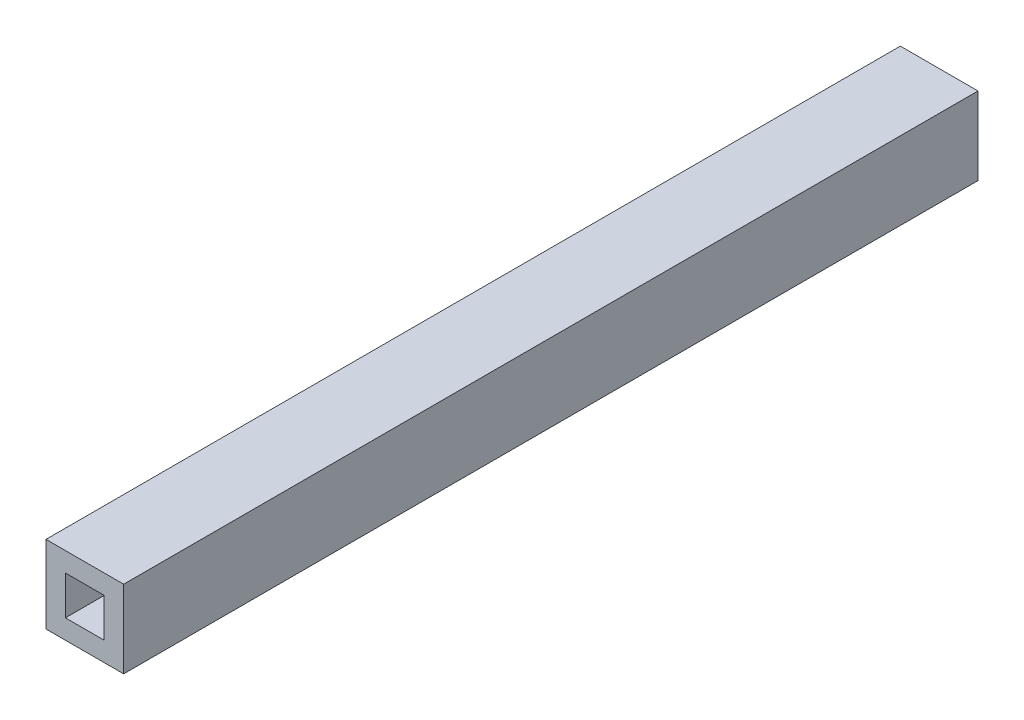
ISO-10303-21;
HEADER;
FILE_DESCRIPTION(('STEP AP214'),'2;1');
FILE_NAME('part.step','',(''),(''),'','','');
FILE_SCHEMA(('AUTOMOTIVE_DESIGN { 1 0 10303 214 1 1 1 1 }'));
ENDSEC;
DATA;
#1=APPLICATION_CONTEXT('core data for automotive mechanical design processes');
#2=APPLICATION_PROTOCOL_DEFINITION('international standard','automotive_design',2000,#1);
#3=PRODUCT_CONTEXT('',#1,'mechanical');
#4=PRODUCT('Part','Part','',(#3));
#5=PRODUCT_RELATED_PRODUCT_CATEGORY('part','',(#4));
#6=PRODUCT_DEFINITION_FORMATION('','',#4);
#7=PRODUCT_DEFINITION_CONTEXT('part definition',#1,'design');
#8=PRODUCT_DEFINITION('design','',#6,#7);
#9=PRODUCT_DEFINITION_SHAPE('','',#8);
#10=(LENGTH_UNIT() NAMED_UNIT(*) SI_UNIT(.MILLI.,.METRE.));
#11=(NAMED_UNIT(*) PLANE_ANGLE_UNIT() SI_UNIT($,.RADIAN.));
#12=(NAMED_UNIT(*) SI_UNIT($,.STERADIAN.) SOLID_ANGLE_UNIT());
#13=UNCERTAINTY_MEASURE_WITH_UNIT(LENGTH_MEASURE(1.E-05),#10,'distance_accuracy_value','');
#14=(GEOMETRIC_REPRESENTATION_CONTEXT(3) GLOBAL_UNCERTAINTY_ASSIGNED_CONTEXT((#13)) GLOBAL_UNIT_ASSIGNED_CONTEXT((#10,
#11,#12)) REPRESENTATION_CONTEXT('',''));
#15=CARTESIAN_POINT('',(0.,0.,0.));
#16=DIRECTION('',(0.,0.,1.));
#17=DIRECTION('',(1.,0.,0.));
#18=AXIS2_PLACEMENT_3D('',#15,#16,#17);
#19=CARTESIAN_POINT('',(0.,0.,220.));
#20=DIRECTION('',(0.,0.,1.));
#21=DIRECTION('',(1.,0.,0.));
#22=AXIS2_PLACEMENT_3D('',#19,#20,#21);
#23=PLANE('',#22);
#24=DIRECTION('',(0.,1.,0.));
#25=VECTOR('',#24,1.);
#26=CARTESIAN_POINT('',(10.,-10.,220.));
#27=LINE('',#26,#25);
#28=CARTESIAN_POINT('',(10.,-10.,220.));
#29=VERTEX_POINT('',#28);
#30=CARTESIAN_POINT('',(10.,10.,220.));
#31=VERTEX_POINT('',#30);
#32=EDGE_CURVE('E158',#29,#31,#27,.T.);
#33=ORIENTED_EDGE('',*,*,#32,.T.);
#34=DIRECTION('',(-1.,0.,0.));
#35=VECTOR('',#34,1.);
#36=CARTESIAN_POINT('',(-10.,10.,220.));
#37=LINE('',#36,#35);
#38=CARTESIAN_POINT('',(-10.,10.,220.));
#39=VERTEX_POINT('',#38);
#40=EDGE_CURVE('E161',#31,#39,#37,.T.);
#41=ORIENTED_EDGE('',*,*,#40,.T.);
#42=DIRECTION('',(0.,-1.,0.));
#43=VECTOR('',#42,1.);
#44=CARTESIAN_POINT('',(-10.,-10.,220.));
#45=LINE('',#44,#43);
#46=CARTESIAN_POINT('',(-10.,-10.,220.));
#47=VERTEX_POINT('',#46);
#48=EDGE_CURVE('E164',#39,#47,#45,.T.);
#49=ORIENTED_EDGE('',*,*,#48,.T.);
#50=DIRECTION('',(1.,0.,0.));
#51=VECTOR('',#50,1.);
#52=CARTESIAN_POINT('',(-10.,-10.,220.));
#53=LINE('',#52,#51);
#54=EDGE_CURVE('E166',#47,#29,#53,.T.);
#55=ORIENTED_EDGE('',*,*,#54,.T.);
#56=EDGE_LOOP('',(#33,#41,#49,#55));
#57=FACE_BOUND('',#56,.T.);
#58=DIRECTION('',(-1.,0.,0.));
#59=VECTOR('',#58,1.);
#60=CARTESIAN_POINT('',(0.,5.,220.));
#61=LINE('',#60,#59);
#62=CARTESIAN_POINT('',(5.,5.,220.));
#63=VERTEX_POINT('',#62);
#64=CARTESIAN_POINT('',(-5.,5.,220.));
#65=VERTEX_POINT('',#64);
#66=EDGE_CURVE('E130',#63,#65,#61,.T.);
#67=ORIENTED_EDGE('',*,*,#66,.F.);
#68=DIRECTION('',(0.,1.,0.));
#69=VECTOR('',#68,1.);
#70=CARTESIAN_POINT('',(5.,0.,220.));
#71=LINE('',#70,#69);
#72=CARTESIAN_POINT('',(5.,-5.,220.));
#73=VERTEX_POINT('',#72);
#74=EDGE_CURVE('E122',#73,#63,#71,.T.);
#75=ORIENTED_EDGE('',*,*,#74,.F.);
#76=DIRECTION('',(1.,0.,0.));
#77=VECTOR('',#76,1.);
#78=CARTESIAN_POINT('',(0.,-5.,220.));
#79=LINE('',#78,#77);
#80=CARTESIAN_POINT('',(-5.,-5.,220.));
#81=VERTEX_POINT('',#80);
#82=EDGE_CURVE('E144',#81,#73,#79,.T.);
#83=ORIENTED_EDGE('',*,*,#82,.F.);
#84=DIRECTION('',(0.,-1.,0.));
#85=VECTOR('',#84,1.);
#86=CARTESIAN_POINT('',(-5.,0.,220.));
#87=LINE('',#86,#85);
#88=EDGE_CURVE('E142',#65,#81,#87,.T.);
#89=ORIENTED_EDGE('',*,*,#88,.F.);
#90=EDGE_LOOP('',(#67,#75,#83,#89));
#91=FACE_BOUND('',#90,.T.);
#92=ADVANCED_FACE('F57',(#57,#91),#23,.T.);
#93=CARTESIAN_POINT('',(0.,0.,0.));
#94=DIRECTION('',(0.,0.,1.));
#95=DIRECTION('',(1.,0.,0.));
#96=AXIS2_PLACEMENT_3D('',#93,#94,#95);
#97=PLANE('',#96);
#98=DIRECTION('',(0.,1.,0.));
#99=VECTOR('',#98,1.);
#100=CARTESIAN_POINT('',(10.,-10.,0.));
#101=LINE('',#100,#99);
#102=CARTESIAN_POINT('',(10.,-10.,0.));
#103=VERTEX_POINT('',#102);
#104=CARTESIAN_POINT('',(10.,10.,0.));
#105=VERTEX_POINT('',#104);
#106=EDGE_CURVE('E138',#103,#105,#101,.T.);
#107=ORIENTED_EDGE('',*,*,#106,.F.);
#108=DIRECTION('',(1.,0.,0.));
#109=VECTOR('',#108,1.);
#110=CARTESIAN_POINT('',(-10.,-10.,0.));
#111=LINE('',#110,#109);
#112=CARTESIAN_POINT('',(-10.,-10.,0.));
#113=VERTEX_POINT('',#112);
#114=EDGE_CURVE('E162',#113,#103,#111,.T.);
#115=ORIENTED_EDGE('',*,*,#114,.F.);
#116=DIRECTION('',(0.,-1.,0.));
#117=VECTOR('',#116,1.);
#118=CARTESIAN_POINT('',(-10.,-10.,0.));
#119=LINE('',#118,#117);
#120=CARTESIAN_POINT('',(-10.,10.,0.));
#121=VERTEX_POINT('',#120);
#122=EDGE_CURVE('E173',#121,#113,#119,.T.);
#123=ORIENTED_EDGE('',*,*,#122,.F.);
#124=DIRECTION('',(-1.,0.,0.));
#125=VECTOR('',#124,1.);
#126=CARTESIAN_POINT('',(-10.,10.,0.));
#127=LINE('',#126,#125);
#128=EDGE_CURVE('E171',#105,#121,#127,.T.);
#129=ORIENTED_EDGE('',*,*,#128,.F.);
#130=EDGE_LOOP('',(#107,#115,#123,#129));
#131=FACE_BOUND('',#130,.T.);
#132=DIRECTION('',(0.,1.,0.));
#133=VECTOR('',#132,1.);
#134=CARTESIAN_POINT('',(5.,0.,0.));
#135=LINE('',#134,#133);
#136=CARTESIAN_POINT('',(5.,-5.,0.));
#137=VERTEX_POINT('',#136);
#138=CARTESIAN_POINT('',(5.,5.,0.));
#139=VERTEX_POINT('',#138);
#140=EDGE_CURVE('E80',#137,#139,#135,.T.);
#141=ORIENTED_EDGE('',*,*,#140,.T.);
#142=DIRECTION('',(-1.,0.,0.));
#143=VECTOR('',#142,1.);
#144=CARTESIAN_POINT('',(0.,5.,0.));
#145=LINE('',#144,#143);
#146=CARTESIAN_POINT('',(-5.,5.,0.));
#147=VERTEX_POINT('',#146);
#148=EDGE_CURVE('E137',#139,#147,#145,.T.);
#149=ORIENTED_EDGE('',*,*,#148,.T.);
#150=DIRECTION('',(0.,-1.,0.));
#151=VECTOR('',#150,1.);
#152=CARTESIAN_POINT('',(-5.,0.,0.));
#153=LINE('',#152,#151);
#154=CARTESIAN_POINT('',(-5.,-5.,0.));
#155=VERTEX_POINT('',#154);
#156=EDGE_CURVE('E150',#147,#155,#153,.T.);
#157=ORIENTED_EDGE('',*,*,#156,.T.);
#158=DIRECTION('',(1.,0.,0.));
#159=VECTOR('',#158,1.);
#160=CARTESIAN_POINT('',(0.,-5.,0.));
#161=LINE('',#160,#159);
#162=EDGE_CURVE('E131',#155,#137,#161,.T.);
#163=ORIENTED_EDGE('',*,*,#162,.T.);
#164=EDGE_LOOP('',(#141,#149,#157,#163));
#165=FACE_BOUND('',#164,.T.);
#166=ADVANCED_FACE('F191',(#131,#165),#97,.F.);
#167=CARTESIAN_POINT('',(10.,-10.,220.));
#168=DIRECTION('',(-1.,0.,0.));
#169=DIRECTION('',(0.,0.,1.));
#170=AXIS2_PLACEMENT_3D('',#167,#168,#169);
#171=PLANE('',#170);
#172=ORIENTED_EDGE('',*,*,#106,.T.);
#173=DIRECTION('',(0.,0.,-1.));
#174=VECTOR('',#173,1.);
#175=CARTESIAN_POINT('',(10.,10.,220.));
#176=LINE('',#175,#174);
#177=EDGE_CURVE('E12',#31,#105,#176,.T.);
#178=ORIENTED_EDGE('',*,*,#177,.F.);
#179=ORIENTED_EDGE('',*,*,#32,.F.);
#180=DIRECTION('',(0.,0.,-1.));
#181=VECTOR('',#180,1.);
#182=CARTESIAN_POINT('',(10.,-10.,220.));
#183=LINE('',#182,#181);
#184=EDGE_CURVE('E168',#29,#103,#183,.T.);
#185=ORIENTED_EDGE('',*,*,#184,.T.);
#186=EDGE_LOOP('',(#172,#178,#179,#185));
#187=FACE_BOUND('',#186,.T.);
#188=ADVANCED_FACE('F59',(#187),#171,.F.);
#189=CARTESIAN_POINT('',(-10.,10.,220.));
#190=DIRECTION('',(0.,-1.,0.));
#191=DIRECTION('',(0.,0.,-1.));
#192=AXIS2_PLACEMENT_3D('',#189,#190,#191);
#193=PLANE('',#192);
#194=ORIENTED_EDGE('',*,*,#128,.T.);
#195=DIRECTION('',(0.,0.,-1.));
#196=VECTOR('',#195,1.);
#197=CARTESIAN_POINT('',(-10.,10.,220.));
#198=LINE('',#197,#196);
#199=EDGE_CURVE('E65',#39,#121,#198,.T.);
#200=ORIENTED_EDGE('',*,*,#199,.F.);
#201=ORIENTED_EDGE('',*,*,#40,.F.);
#202=ORIENTED_EDGE('',*,*,#177,.T.);
#203=EDGE_LOOP('',(#194,#200,#201,#202));
#204=FACE_BOUND('',#203,.T.);
#205=ADVANCED_FACE('F201',(#204),#193,.F.);
#206=CARTESIAN_POINT('',(-10.,-10.,220.));
#207=DIRECTION('',(1.,0.,0.));
#208=DIRECTION('',(0.,0.,-1.));
#209=AXIS2_PLACEMENT_3D('',#206,#207,#208);
#210=PLANE('',#209);
#211=ORIENTED_EDGE('',*,*,#122,.T.);
#212=DIRECTION('',(0.,0.,-1.));
#213=VECTOR('',#212,1.);
#214=CARTESIAN_POINT('',(-10.,-10.,220.));
#215=LINE('',#214,#213);
#216=EDGE_CURVE('E178',#47,#113,#215,.T.);
#217=ORIENTED_EDGE('',*,*,#216,.F.);
#218=ORIENTED_EDGE('',*,*,#48,.F.);
#219=ORIENTED_EDGE('',*,*,#199,.T.);
#220=EDGE_LOOP('',(#211,#217,#218,#219));
#221=FACE_BOUND('',#220,.T.);
#222=ADVANCED_FACE('F185',(#221),#210,.F.);
#223=CARTESIAN_POINT('',(-10.,-10.,220.));
#224=DIRECTION('',(0.,1.,0.));
#225=DIRECTION('',(0.,0.,1.));
#226=AXIS2_PLACEMENT_3D('',#223,#224,#225);
#227=PLANE('',#226);
#228=ORIENTED_EDGE('',*,*,#114,.T.);
#229=ORIENTED_EDGE('',*,*,#184,.F.);
#230=ORIENTED_EDGE('',*,*,#54,.F.);
#231=ORIENTED_EDGE('',*,*,#216,.T.);
#232=EDGE_LOOP('',(#228,#229,#230,#231));
#233=FACE_BOUND('',#232,.T.);
#234=ADVANCED_FACE('F195',(#233),#227,.F.);
#235=CARTESIAN_POINT('',(5.,0.,220.));
#236=DIRECTION('',(-1.,0.,0.));
#237=DIRECTION('',(0.,0.,1.));
#238=AXIS2_PLACEMENT_3D('',#235,#236,#237);
#239=PLANE('',#238);
#240=ORIENTED_EDGE('',*,*,#140,.F.);
#241=DIRECTION('',(0.,0.,-1.));
#242=VECTOR('',#241,1.);
#243=CARTESIAN_POINT('',(5.,-5.,220.));
#244=LINE('',#243,#242);
#245=EDGE_CURVE('E126',#73,#137,#244,.T.);
#246=ORIENTED_EDGE('',*,*,#245,.F.);
#247=ORIENTED_EDGE('',*,*,#74,.T.);
#248=DIRECTION('',(0.,0.,-1.));
#249=VECTOR('',#248,1.);
#250=CARTESIAN_POINT('',(5.,5.,220.));
#251=LINE('',#250,#249);
#252=EDGE_CURVE('E125',#63,#139,#251,.T.);
#253=ORIENTED_EDGE('',*,*,#252,.T.);
#254=EDGE_LOOP('',(#240,#246,#247,#253));
#255=FACE_BOUND('',#254,.T.);
#256=ADVANCED_FACE('F124',(#255),#239,.T.);
#257=CARTESIAN_POINT('',(0.,5.,220.));
#258=DIRECTION('',(0.,-1.,0.));
#259=DIRECTION('',(0.,0.,-1.));
#260=AXIS2_PLACEMENT_3D('',#257,#258,#259);
#261=PLANE('',#260);
#262=ORIENTED_EDGE('',*,*,#148,.F.);
#263=ORIENTED_EDGE('',*,*,#252,.F.);
#264=ORIENTED_EDGE('',*,*,#66,.T.);
#265=DIRECTION('',(0.,0.,-1.));
#266=VECTOR('',#265,1.);
#267=CARTESIAN_POINT('',(-5.,5.,220.));
#268=LINE('',#267,#266);
#269=EDGE_CURVE('E139',#65,#147,#268,.T.);
#270=ORIENTED_EDGE('',*,*,#269,.T.);
#271=EDGE_LOOP('',(#262,#263,#264,#270));
#272=FACE_BOUND('',#271,.T.);
#273=ADVANCED_FACE('F134',(#272),#261,.T.);
#274=CARTESIAN_POINT('',(-5.,0.,220.));
#275=DIRECTION('',(1.,0.,0.));
#276=DIRECTION('',(0.,0.,-1.));
#277=AXIS2_PLACEMENT_3D('',#274,#275,#276);
#278=PLANE('',#277);
#279=ORIENTED_EDGE('',*,*,#156,.F.);
#280=ORIENTED_EDGE('',*,*,#269,.F.);
#281=ORIENTED_EDGE('',*,*,#88,.T.);
#282=DIRECTION('',(0.,0.,-1.));
#283=VECTOR('',#282,1.);
#284=CARTESIAN_POINT('',(-5.,-5.,220.));
#285=LINE('',#284,#283);
#286=EDGE_CURVE('E72',#81,#155,#285,.T.);
#287=ORIENTED_EDGE('',*,*,#286,.T.);
#288=EDGE_LOOP('',(#279,#280,#281,#287));
#289=FACE_BOUND('',#288,.T.);
#290=ADVANCED_FACE('F224',(#289),#278,.T.);
#291=CARTESIAN_POINT('',(0.,-5.,220.));
#292=DIRECTION('',(0.,1.,0.));
#293=DIRECTION('',(0.,0.,1.));
#294=AXIS2_PLACEMENT_3D('',#291,#292,#293);
#295=PLANE('',#294);
#296=ORIENTED_EDGE('',*,*,#162,.F.);
#297=ORIENTED_EDGE('',*,*,#286,.F.);
#298=ORIENTED_EDGE('',*,*,#82,.T.);
#299=ORIENTED_EDGE('',*,*,#245,.T.);
#300=EDGE_LOOP('',(#296,#297,#298,#299));
#301=FACE_BOUND('',#300,.T.);
#302=ADVANCED_FACE('F228',(#301),#295,.T.);
#303=CLOSED_SHELL('',(#92,#166,#188,#205,#222,#234,#256,#273,#290,#302));
#304=MANIFOLD_SOLID_BREP('B2',#303);
#305=ADVANCED_BREP_SHAPE_REPRESENTATION('',(#18,#304),#14);
#306=SHAPE_DEFINITION_REPRESENTATION(#9,#305);
ENDSEC;
END-ISO-10303-21;
